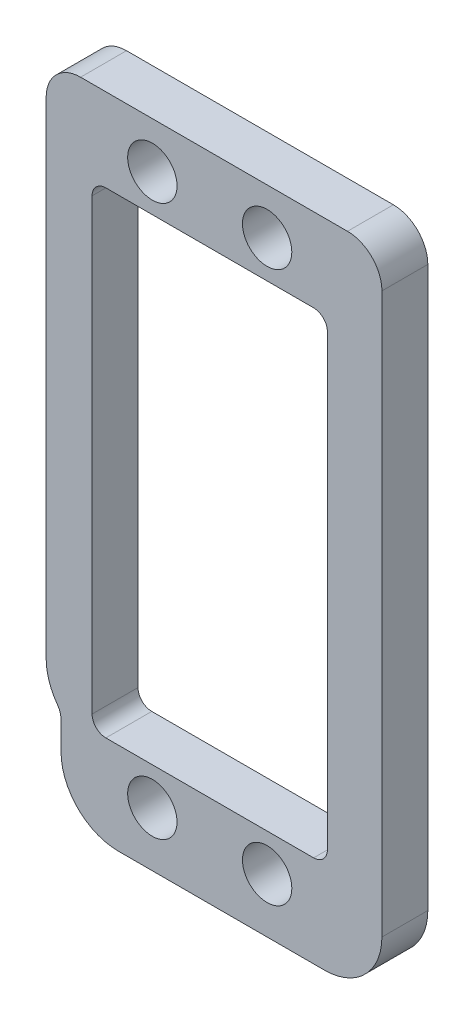
ISO-10303-21;
HEADER;
FILE_DESCRIPTION(('STEP AP214'),'2;1');
FILE_NAME('part.step','',(''),(''),'','','');
FILE_SCHEMA(('AUTOMOTIVE_DESIGN { 1 0 10303 214 1 1 1 1 }'));
ENDSEC;
DATA;
#1=APPLICATION_CONTEXT('core data for automotive mechanical design processes');
#2=APPLICATION_PROTOCOL_DEFINITION('international standard','automotive_design',2000,#1);
#3=PRODUCT_CONTEXT('',#1,'mechanical');
#4=PRODUCT('Part','Part','',(#3));
#5=PRODUCT_RELATED_PRODUCT_CATEGORY('part','',(#4));
#6=PRODUCT_DEFINITION_FORMATION('','',#4);
#7=PRODUCT_DEFINITION_CONTEXT('part definition',#1,'design');
#8=PRODUCT_DEFINITION('design','',#6,#7);
#9=PRODUCT_DEFINITION_SHAPE('','',#8);
#10=(LENGTH_UNIT() NAMED_UNIT(*) SI_UNIT(.MILLI.,.METRE.));
#11=(NAMED_UNIT(*) PLANE_ANGLE_UNIT() SI_UNIT($,.RADIAN.));
#12=(NAMED_UNIT(*) SI_UNIT($,.STERADIAN.) SOLID_ANGLE_UNIT());
#13=UNCERTAINTY_MEASURE_WITH_UNIT(LENGTH_MEASURE(1.E-05),#10,'distance_accuracy_value','');
#14=(GEOMETRIC_REPRESENTATION_CONTEXT(3) GLOBAL_UNCERTAINTY_ASSIGNED_CONTEXT((#13)) GLOBAL_UNIT_ASSIGNED_CONTEXT((#10,
#11,#12)) REPRESENTATION_CONTEXT('',''));
#15=CARTESIAN_POINT('',(0.,0.,0.));
#16=DIRECTION('',(0.,0.,1.));
#17=DIRECTION('',(1.,0.,0.));
#18=AXIS2_PLACEMENT_3D('',#15,#16,#17);
#19=CARTESIAN_POINT('',(100.,0.,4.));
#20=DIRECTION('',(-1.,0.,0.));
#21=DIRECTION('',(0.,-1.,0.));
#22=AXIS2_PLACEMENT_3D('',#19,#20,#21);
#23=PLANE('',#22);
#24=DIRECTION('',(0.,1.,0.));
#25=VECTOR('',#24,1.);
#26=CARTESIAN_POINT('',(100.,0.,4.));
#27=LINE('',#26,#25);
#28=CARTESIAN_POINT('',(100.,-65.75,4.));
#29=VERTEX_POINT('',#28);
#30=CARTESIAN_POINT('',(100.,-17.,4.));
#31=VERTEX_POINT('',#30);
#32=EDGE_CURVE('E237',#29,#31,#27,.T.);
#33=ORIENTED_EDGE('',*,*,#32,.F.);
#34=DIRECTION('',(0.,0.,-1.));
#35=VECTOR('',#34,1.);
#36=CARTESIAN_POINT('',(100.,-65.75,0.));
#37=LINE('',#36,#35);
#38=CARTESIAN_POINT('',(100.,-65.75,0.));
#39=VERTEX_POINT('',#38);
#40=EDGE_CURVE('E305',#29,#39,#37,.T.);
#41=ORIENTED_EDGE('',*,*,#40,.T.);
#42=DIRECTION('',(0.,1.,0.));
#43=VECTOR('',#42,1.);
#44=CARTESIAN_POINT('',(100.,0.,0.));
#45=LINE('',#44,#43);
#46=CARTESIAN_POINT('',(100.,-17.,0.));
#47=VERTEX_POINT('',#46);
#48=EDGE_CURVE('E234',#39,#47,#45,.T.);
#49=ORIENTED_EDGE('',*,*,#48,.T.);
#50=DIRECTION('',(0.,0.,1.));
#51=VECTOR('',#50,1.);
#52=CARTESIAN_POINT('',(100.,-17.,4.));
#53=LINE('',#52,#51);
#54=EDGE_CURVE('E292',#47,#31,#53,.T.);
#55=ORIENTED_EDGE('',*,*,#54,.T.);
#56=EDGE_LOOP('',(#33,#41,#49,#55));
#57=FACE_BOUND('',#56,.T.);
#58=ADVANCED_FACE('F47',(#57),#23,.F.);
#59=CARTESIAN_POINT('',(72.04422863406,0.,-6.));
#60=DIRECTION('',(1.,0.,0.));
#61=DIRECTION('',(0.,0.,-1.));
#62=AXIS2_PLACEMENT_3D('',#59,#60,#61);
#63=PLANE('',#62);
#64=DIRECTION('',(0.,1.,0.));
#65=VECTOR('',#64,1.);
#66=CARTESIAN_POINT('',(72.04422863406,0.,0.));
#67=LINE('',#66,#65);
#68=CARTESIAN_POINT('',(72.04422863406,-65.75,0.));
#69=VERTEX_POINT('',#68);
#70=CARTESIAN_POINT('',(72.04422863406,-63.3230164028552,0.));
#71=VERTEX_POINT('',#70);
#72=EDGE_CURVE('E295',#69,#71,#67,.T.);
#73=ORIENTED_EDGE('',*,*,#72,.F.);
#74=DIRECTION('',(0.,0.,-1.));
#75=VECTOR('',#74,1.);
#76=CARTESIAN_POINT('',(72.04422863406,-65.75,4.));
#77=LINE('',#76,#75);
#78=CARTESIAN_POINT('',(72.04422863406,-65.75,4.));
#79=VERTEX_POINT('',#78);
#80=EDGE_CURVE('E11',#69,#79,#77,.F.);
#81=ORIENTED_EDGE('',*,*,#80,.T.);
#82=DIRECTION('',(0.,1.,0.));
#83=VECTOR('',#82,1.);
#84=CARTESIAN_POINT('',(72.04422863406,0.,4.));
#85=LINE('',#84,#83);
#86=CARTESIAN_POINT('',(72.04422863406,-63.3230164028552,4.));
#87=VERTEX_POINT('',#86);
#88=EDGE_CURVE('E352',#79,#87,#85,.T.);
#89=ORIENTED_EDGE('',*,*,#88,.T.);
#90=DIRECTION('',(0.,0.,1.));
#91=VECTOR('',#90,1.);
#92=CARTESIAN_POINT('',(72.04422863406,-63.3230164028552,0.));
#93=LINE('',#92,#91);
#94=EDGE_CURVE('E297',#87,#71,#93,.F.);
#95=ORIENTED_EDGE('',*,*,#94,.T.);
#96=EDGE_LOOP('',(#73,#81,#89,#95));
#97=FACE_BOUND('',#96,.T.);
#98=ADVANCED_FACE('F351',(#97),#63,.F.);
#99=CARTESIAN_POINT('',(70.75,0.,0.));
#100=DIRECTION('',(1.,0.,0.));
#101=DIRECTION('',(0.,0.,-1.));
#102=AXIS2_PLACEMENT_3D('',#99,#100,#101);
#103=PLANE('',#102);
#104=DIRECTION('',(0.,1.,0.));
#105=VECTOR('',#104,1.);
#106=CARTESIAN_POINT('',(70.75,0.,0.));
#107=LINE('',#106,#105);
#108=CARTESIAN_POINT('',(70.75,-59.3647799345297,0.));
#109=VERTEX_POINT('',#108);
#110=CARTESIAN_POINT('',(70.75,-17.,0.));
#111=VERTEX_POINT('',#110);
#112=EDGE_CURVE('E331',#109,#111,#107,.T.);
#113=ORIENTED_EDGE('',*,*,#112,.F.);
#114=DIRECTION('',(0.,0.,-1.));
#115=VECTOR('',#114,1.);
#116=CARTESIAN_POINT('',(70.75,-59.3647799345297,0.));
#117=LINE('',#116,#115);
#118=CARTESIAN_POINT('',(70.75,-59.3647799345297,4.));
#119=VERTEX_POINT('',#118);
#120=EDGE_CURVE('E55',#109,#119,#117,.F.);
#121=ORIENTED_EDGE('',*,*,#120,.T.);
#122=DIRECTION('',(0.,1.,0.));
#123=VECTOR('',#122,1.);
#124=CARTESIAN_POINT('',(70.75,0.,4.));
#125=LINE('',#124,#123);
#126=CARTESIAN_POINT('',(70.75,-17.,4.));
#127=VERTEX_POINT('',#126);
#128=EDGE_CURVE('E330',#119,#127,#125,.T.);
#129=ORIENTED_EDGE('',*,*,#128,.T.);
#130=DIRECTION('',(0.,0.,-1.));
#131=VECTOR('',#130,1.);
#132=CARTESIAN_POINT('',(70.75,-17.,0.));
#133=LINE('',#132,#131);
#134=EDGE_CURVE('E275',#127,#111,#133,.T.);
#135=ORIENTED_EDGE('',*,*,#134,.T.);
#136=EDGE_LOOP('',(#113,#121,#129,#135));
#137=FACE_BOUND('',#136,.T.);
#138=ADVANCED_FACE('F329',(#137),#103,.F.);
#139=CARTESIAN_POINT('',(0.,0.,4.));
#140=DIRECTION('',(0.,0.,1.));
#141=DIRECTION('',(1.,0.,0.));
#142=AXIS2_PLACEMENT_3D('',#139,#140,#141);
#143=PLANE('',#142);
#144=DIRECTION('',(1.,0.,0.));
#145=VECTOR('',#144,1.);
#146=CARTESIAN_POINT('',(0.,-70.75,4.));
#147=LINE('',#146,#145);
#148=CARTESIAN_POINT('',(77.04422863406,-70.75,4.));
#149=VERTEX_POINT('',#148);
#150=CARTESIAN_POINT('',(95.,-70.75,4.));
#151=VERTEX_POINT('',#150);
#152=EDGE_CURVE('E355',#149,#151,#147,.T.);
#153=ORIENTED_EDGE('',*,*,#152,.T.);
#154=CARTESIAN_POINT('',(95.,-65.75,4.));
#155=DIRECTION('',(0.,0.,1.));
#156=DIRECTION('',(1.,0.,0.));
#157=AXIS2_PLACEMENT_3D('',#154,#155,#156);
#158=CIRCLE('',#157,5.);
#159=EDGE_CURVE('E322',#151,#29,#158,.T.);
#160=ORIENTED_EDGE('',*,*,#159,.T.);
#161=ORIENTED_EDGE('',*,*,#32,.T.);
#162=CARTESIAN_POINT('',(97.,-17.,4.));
#163=DIRECTION('',(0.,0.,1.));
#164=DIRECTION('',(1.,0.,0.));
#165=AXIS2_PLACEMENT_3D('',#162,#163,#164);
#166=CIRCLE('',#165,3.);
#167=CARTESIAN_POINT('',(97.,-14.,4.));
#168=VERTEX_POINT('',#167);
#169=EDGE_CURVE('E287',#31,#168,#166,.T.);
#170=ORIENTED_EDGE('',*,*,#169,.T.);
#171=DIRECTION('',(1.,0.,0.));
#172=VECTOR('',#171,1.);
#173=CARTESIAN_POINT('',(0.,-14.,4.));
#174=LINE('',#173,#172);
#175=CARTESIAN_POINT('',(73.7500000000001,-14.,4.));
#176=VERTEX_POINT('',#175);
#177=EDGE_CURVE('E354',#176,#168,#174,.T.);
#178=ORIENTED_EDGE('',*,*,#177,.F.);
#179=CARTESIAN_POINT('',(73.7500000000001,-17.,4.));
#180=DIRECTION('',(0.,0.,1.));
#181=DIRECTION('',(1.,0.,0.));
#182=AXIS2_PLACEMENT_3D('',#179,#180,#181);
#183=CIRCLE('',#182,3.);
#184=EDGE_CURVE('E289',#176,#127,#183,.T.);
#185=ORIENTED_EDGE('',*,*,#184,.T.);
#186=ORIENTED_EDGE('',*,*,#128,.F.);
#187=CARTESIAN_POINT('',(75.7500000000001,-59.3647799345297,4.));
#188=DIRECTION('',(0.,0.,1.));
#189=DIRECTION('',(1.,0.,0.));
#190=AXIS2_PLACEMENT_3D('',#187,#188,#189);
#191=CIRCLE('',#190,5.);
#192=CARTESIAN_POINT('',(71.7158422642239,-62.3186877467129,4.));
#193=VERTEX_POINT('',#192);
#194=EDGE_CURVE('E68',#119,#193,#191,.T.);
#195=ORIENTED_EDGE('',*,*,#194,.T.);
#196=CARTESIAN_POINT('',(70.34422863406,-63.3230164028552,4.));
#197=DIRECTION('',(0.,0.,1.));
#198=DIRECTION('',(1.,0.,0.));
#199=AXIS2_PLACEMENT_3D('',#196,#197,#198);
#200=CIRCLE('',#199,1.7);
#201=EDGE_CURVE('E300',#193,#87,#200,.F.);
#202=ORIENTED_EDGE('',*,*,#201,.T.);
#203=ORIENTED_EDGE('',*,*,#88,.F.);
#204=CARTESIAN_POINT('',(77.04422863406,-65.75,4.));
#205=DIRECTION('',(0.,0.,1.));
#206=DIRECTION('',(1.,0.,0.));
#207=AXIS2_PLACEMENT_3D('',#204,#205,#206);
#208=CIRCLE('',#207,5.);
#209=EDGE_CURVE('E319',#79,#149,#208,.T.);
#210=ORIENTED_EDGE('',*,*,#209,.T.);
#211=EDGE_LOOP('',(#153,#160,#161,#170,#178,#185,#186,#195,#202,#203,#210));
#212=FACE_BOUND('',#211,.T.);
#213=CARTESIAN_POINT('',(80.,-18.,4.));
#214=DIRECTION('',(0.,0.,1.));
#215=DIRECTION('',(1.,0.,0.));
#216=AXIS2_PLACEMENT_3D('',#213,#214,#215);
#217=CIRCLE('',#216,2.15);
#218=CARTESIAN_POINT('',(82.15,-18.,4.));
#219=VERTEX_POINT('',#218);
#220=EDGE_CURVE('E222',#219,#219,#217,.T.);
#221=ORIENTED_EDGE('',*,*,#220,.F.);
#222=EDGE_LOOP('',(#221));
#223=FACE_BOUND('',#222,.T.);
#224=CARTESIAN_POINT('',(90.,-66.,4.));
#225=DIRECTION('',(0.,0.,1.));
#226=DIRECTION('',(1.,0.,0.));
#227=AXIS2_PLACEMENT_3D('',#224,#225,#226);
#228=CIRCLE('',#227,2.15);
#229=CARTESIAN_POINT('',(92.15,-66.,4.));
#230=VERTEX_POINT('',#229);
#231=EDGE_CURVE('E210',#230,#230,#228,.T.);
#232=ORIENTED_EDGE('',*,*,#231,.F.);
#233=EDGE_LOOP('',(#232));
#234=FACE_BOUND('',#233,.T.);
#235=CARTESIAN_POINT('',(80.,-66.,4.));
#236=DIRECTION('',(0.,0.,1.));
#237=DIRECTION('',(1.,0.,0.));
#238=AXIS2_PLACEMENT_3D('',#235,#236,#237);
#239=CIRCLE('',#238,2.15);
#240=CARTESIAN_POINT('',(82.15,-66.,4.));
#241=VERTEX_POINT('',#240);
#242=EDGE_CURVE('E226',#241,#241,#239,.T.);
#243=ORIENTED_EDGE('',*,*,#242,.F.);
#244=EDGE_LOOP('',(#243));
#245=FACE_BOUND('',#244,.T.);
#246=CARTESIAN_POINT('',(90.,-18.,4.));
#247=DIRECTION('',(0.,0.,1.));
#248=DIRECTION('',(1.,0.,0.));
#249=AXIS2_PLACEMENT_3D('',#246,#247,#248);
#250=CIRCLE('',#249,2.15);
#251=CARTESIAN_POINT('',(92.15,-18.,4.));
#252=VERTEX_POINT('',#251);
#253=EDGE_CURVE('E219',#252,#252,#250,.T.);
#254=ORIENTED_EDGE('',*,*,#253,.F.);
#255=EDGE_LOOP('',(#254));
#256=FACE_BOUND('',#255,.T.);
#257=DIRECTION('',(1.,0.,0.));
#258=VECTOR('',#257,1.);
#259=CARTESIAN_POINT('',(74.7500000000001,-62.75,4.));
#260=LINE('',#259,#258);
#261=CARTESIAN_POINT('',(75.9500000000001,-62.75,4.));
#262=VERTEX_POINT('',#261);
#263=CARTESIAN_POINT('',(94.05,-62.75,4.));
#264=VERTEX_POINT('',#263);
#265=EDGE_CURVE('E365',#262,#264,#260,.T.);
#266=ORIENTED_EDGE('',*,*,#265,.F.);
#267=CARTESIAN_POINT('',(75.9500000000001,-61.55,4.));
#268=DIRECTION('',(0.,0.,1.));
#269=DIRECTION('',(1.,0.,0.));
#270=AXIS2_PLACEMENT_3D('',#267,#268,#269);
#271=CIRCLE('',#270,1.2);
#272=CARTESIAN_POINT('',(74.7500000000001,-61.55,4.));
#273=VERTEX_POINT('',#272);
#274=EDGE_CURVE('E205',#262,#273,#271,.F.);
#275=ORIENTED_EDGE('',*,*,#274,.T.);
#276=DIRECTION('',(0.,-1.,0.));
#277=VECTOR('',#276,1.);
#278=CARTESIAN_POINT('',(74.7500000000001,-21.25,4.));
#279=LINE('',#278,#277);
#280=CARTESIAN_POINT('',(74.7500000000001,-22.45,4.));
#281=VERTEX_POINT('',#280);
#282=EDGE_CURVE('E196',#281,#273,#279,.T.);
#283=ORIENTED_EDGE('',*,*,#282,.F.);
#284=CARTESIAN_POINT('',(75.9500000000001,-22.45,4.));
#285=DIRECTION('',(0.,0.,1.));
#286=DIRECTION('',(1.,0.,0.));
#287=AXIS2_PLACEMENT_3D('',#284,#285,#286);
#288=CIRCLE('',#287,1.2);
#289=CARTESIAN_POINT('',(75.9500000000001,-21.25,4.));
#290=VERTEX_POINT('',#289);
#291=EDGE_CURVE('E179',#281,#290,#288,.F.);
#292=ORIENTED_EDGE('',*,*,#291,.T.);
#293=DIRECTION('',(1.,0.,0.));
#294=VECTOR('',#293,1.);
#295=CARTESIAN_POINT('',(74.7500000000001,-21.25,4.));
#296=LINE('',#295,#294);
#297=CARTESIAN_POINT('',(94.05,-21.25,4.));
#298=VERTEX_POINT('',#297);
#299=EDGE_CURVE('E207',#290,#298,#296,.T.);
#300=ORIENTED_EDGE('',*,*,#299,.T.);
#301=CARTESIAN_POINT('',(94.05,-22.45,4.));
#302=DIRECTION('',(0.,0.,1.));
#303=DIRECTION('',(1.,0.,0.));
#304=AXIS2_PLACEMENT_3D('',#301,#302,#303);
#305=CIRCLE('',#304,1.2);
#306=CARTESIAN_POINT('',(95.25,-22.45,4.));
#307=VERTEX_POINT('',#306);
#308=EDGE_CURVE('E271',#298,#307,#305,.F.);
#309=ORIENTED_EDGE('',*,*,#308,.T.);
#310=DIRECTION('',(0.,-1.,0.));
#311=VECTOR('',#310,1.);
#312=CARTESIAN_POINT('',(95.25,-21.25,4.));
#313=LINE('',#312,#311);
#314=CARTESIAN_POINT('',(95.25,-61.55,4.));
#315=VERTEX_POINT('',#314);
#316=EDGE_CURVE('E212',#307,#315,#313,.T.);
#317=ORIENTED_EDGE('',*,*,#316,.T.);
#318=CARTESIAN_POINT('',(94.05,-61.55,4.));
#319=DIRECTION('',(0.,0.,1.));
#320=DIRECTION('',(1.,0.,0.));
#321=AXIS2_PLACEMENT_3D('',#318,#319,#320);
#322=CIRCLE('',#321,1.2);
#323=EDGE_CURVE('E264',#315,#264,#322,.F.);
#324=ORIENTED_EDGE('',*,*,#323,.T.);
#325=EDGE_LOOP('',(#266,#275,#283,#292,#300,#309,#317,#324));
#326=FACE_BOUND('',#325,.T.);
#327=ADVANCED_FACE('F204',(#212,#223,#234,#245,#256,#326),#143,.T.);
#328=CARTESIAN_POINT('',(0.,0.,0.));
#329=DIRECTION('',(0.,0.,1.));
#330=DIRECTION('',(1.,0.,0.));
#331=AXIS2_PLACEMENT_3D('',#328,#329,#330);
#332=PLANE('',#331);
#333=ORIENTED_EDGE('',*,*,#48,.F.);
#334=CARTESIAN_POINT('',(95.,-65.75,0.));
#335=DIRECTION('',(0.,0.,1.));
#336=DIRECTION('',(1.,0.,0.));
#337=AXIS2_PLACEMENT_3D('',#334,#335,#336);
#338=CIRCLE('',#337,5.);
#339=CARTESIAN_POINT('',(95.,-70.75,0.));
#340=VERTEX_POINT('',#339);
#341=EDGE_CURVE('E312',#39,#340,#338,.F.);
#342=ORIENTED_EDGE('',*,*,#341,.T.);
#343=DIRECTION('',(-1.,0.,0.));
#344=VECTOR('',#343,1.);
#345=CARTESIAN_POINT('',(0.,-70.75,0.));
#346=LINE('',#345,#344);
#347=CARTESIAN_POINT('',(77.04422863406,-70.75,0.));
#348=VERTEX_POINT('',#347);
#349=EDGE_CURVE('E359',#340,#348,#346,.T.);
#350=ORIENTED_EDGE('',*,*,#349,.T.);
#351=CARTESIAN_POINT('',(77.04422863406,-65.75,0.));
#352=DIRECTION('',(0.,0.,1.));
#353=DIRECTION('',(1.,0.,0.));
#354=AXIS2_PLACEMENT_3D('',#351,#352,#353);
#355=CIRCLE('',#354,5.);
#356=EDGE_CURVE('E308',#348,#69,#355,.F.);
#357=ORIENTED_EDGE('',*,*,#356,.T.);
#358=ORIENTED_EDGE('',*,*,#72,.T.);
#359=CARTESIAN_POINT('',(70.34422863406,-63.3230164028552,0.));
#360=DIRECTION('',(0.,0.,1.));
#361=DIRECTION('',(1.,0.,0.));
#362=AXIS2_PLACEMENT_3D('',#359,#360,#361);
#363=CIRCLE('',#362,1.7);
#364=CARTESIAN_POINT('',(71.7158422642239,-62.3186877467129,0.));
#365=VERTEX_POINT('',#364);
#366=EDGE_CURVE('E302',#71,#365,#363,.T.);
#367=ORIENTED_EDGE('',*,*,#366,.T.);
#368=CARTESIAN_POINT('',(75.7500000000001,-59.3647799345297,0.));
#369=DIRECTION('',(0.,0.,1.));
#370=DIRECTION('',(1.,0.,0.));
#371=AXIS2_PLACEMENT_3D('',#368,#369,#370);
#372=CIRCLE('',#371,5.);
#373=EDGE_CURVE('E310',#365,#109,#372,.F.);
#374=ORIENTED_EDGE('',*,*,#373,.T.);
#375=ORIENTED_EDGE('',*,*,#112,.T.);
#376=CARTESIAN_POINT('',(73.7500000000001,-17.,0.));
#377=DIRECTION('',(0.,0.,1.));
#378=DIRECTION('',(1.,0.,0.));
#379=AXIS2_PLACEMENT_3D('',#376,#377,#378);
#380=CIRCLE('',#379,3.);
#381=CARTESIAN_POINT('',(73.7500000000001,-14.,0.));
#382=VERTEX_POINT('',#381);
#383=EDGE_CURVE('E281',#111,#382,#380,.F.);
#384=ORIENTED_EDGE('',*,*,#383,.T.);
#385=DIRECTION('',(1.,0.,0.));
#386=VECTOR('',#385,1.);
#387=CARTESIAN_POINT('',(0.,-14.,0.));
#388=LINE('',#387,#386);
#389=CARTESIAN_POINT('',(97.,-14.,0.));
#390=VERTEX_POINT('',#389);
#391=EDGE_CURVE('E338',#382,#390,#388,.T.);
#392=ORIENTED_EDGE('',*,*,#391,.T.);
#393=CARTESIAN_POINT('',(97.,-17.,0.));
#394=DIRECTION('',(0.,0.,1.));
#395=DIRECTION('',(1.,0.,0.));
#396=AXIS2_PLACEMENT_3D('',#393,#394,#395);
#397=CIRCLE('',#396,3.);
#398=EDGE_CURVE('E278',#390,#47,#397,.F.);
#399=ORIENTED_EDGE('',*,*,#398,.T.);
#400=EDGE_LOOP('',(#333,#342,#350,#357,#358,#367,#374,#375,#384,#392,#399));
#401=FACE_BOUND('',#400,.T.);
#402=CARTESIAN_POINT('',(80.,-18.,0.));
#403=DIRECTION('',(0.,0.,1.));
#404=DIRECTION('',(1.,0.,0.));
#405=AXIS2_PLACEMENT_3D('',#402,#403,#404);
#406=CIRCLE('',#405,2.15);
#407=CARTESIAN_POINT('',(82.15,-18.,0.));
#408=VERTEX_POINT('',#407);
#409=EDGE_CURVE('E231',#408,#408,#406,.T.);
#410=ORIENTED_EDGE('',*,*,#409,.T.);
#411=EDGE_LOOP('',(#410));
#412=FACE_BOUND('',#411,.T.);
#413=CARTESIAN_POINT('',(90.,-66.,0.));
#414=DIRECTION('',(0.,0.,1.));
#415=DIRECTION('',(1.,0.,0.));
#416=AXIS2_PLACEMENT_3D('',#413,#414,#415);
#417=CIRCLE('',#416,2.15);
#418=CARTESIAN_POINT('',(92.15,-66.,0.));
#419=VERTEX_POINT('',#418);
#420=EDGE_CURVE('E206',#419,#419,#417,.T.);
#421=ORIENTED_EDGE('',*,*,#420,.T.);
#422=EDGE_LOOP('',(#421));
#423=FACE_BOUND('',#422,.T.);
#424=CARTESIAN_POINT('',(80.,-66.,0.));
#425=DIRECTION('',(0.,0.,1.));
#426=DIRECTION('',(1.,0.,0.));
#427=AXIS2_PLACEMENT_3D('',#424,#425,#426);
#428=CIRCLE('',#427,2.15);
#429=CARTESIAN_POINT('',(82.15,-66.,0.));
#430=VERTEX_POINT('',#429);
#431=EDGE_CURVE('E217',#430,#430,#428,.T.);
#432=ORIENTED_EDGE('',*,*,#431,.T.);
#433=EDGE_LOOP('',(#432));
#434=FACE_BOUND('',#433,.T.);
#435=CARTESIAN_POINT('',(90.,-18.,0.));
#436=DIRECTION('',(0.,0.,1.));
#437=DIRECTION('',(1.,0.,0.));
#438=AXIS2_PLACEMENT_3D('',#435,#436,#437);
#439=CIRCLE('',#438,2.15);
#440=CARTESIAN_POINT('',(92.15,-18.,0.));
#441=VERTEX_POINT('',#440);
#442=EDGE_CURVE('E223',#441,#441,#439,.T.);
#443=ORIENTED_EDGE('',*,*,#442,.T.);
#444=EDGE_LOOP('',(#443));
#445=FACE_BOUND('',#444,.T.);
#446=DIRECTION('',(1.,0.,0.));
#447=VECTOR('',#446,1.);
#448=CARTESIAN_POINT('',(0.,-21.25,0.));
#449=LINE('',#448,#447);
#450=CARTESIAN_POINT('',(75.9500000000001,-21.25,0.));
#451=VERTEX_POINT('',#450);
#452=CARTESIAN_POINT('',(94.05,-21.25,0.));
#453=VERTEX_POINT('',#452);
#454=EDGE_CURVE('E243',#451,#453,#449,.T.);
#455=ORIENTED_EDGE('',*,*,#454,.F.);
#456=CARTESIAN_POINT('',(75.9500000000001,-22.45,0.));
#457=DIRECTION('',(0.,0.,1.));
#458=DIRECTION('',(1.,0.,0.));
#459=AXIS2_PLACEMENT_3D('',#456,#457,#458);
#460=CIRCLE('',#459,1.2);
#461=CARTESIAN_POINT('',(74.7500000000001,-22.45,0.));
#462=VERTEX_POINT('',#461);
#463=EDGE_CURVE('E189',#451,#462,#460,.T.);
#464=ORIENTED_EDGE('',*,*,#463,.T.);
#465=DIRECTION('',(0.,-1.,0.));
#466=VECTOR('',#465,1.);
#467=CARTESIAN_POINT('',(74.7500000000001,0.,0.));
#468=LINE('',#467,#466);
#469=CARTESIAN_POINT('',(74.7500000000001,-61.55,0.));
#470=VERTEX_POINT('',#469);
#471=EDGE_CURVE('E199',#462,#470,#468,.T.);
#472=ORIENTED_EDGE('',*,*,#471,.T.);
#473=CARTESIAN_POINT('',(75.9500000000001,-61.55,0.));
#474=DIRECTION('',(0.,0.,1.));
#475=DIRECTION('',(1.,0.,0.));
#476=AXIS2_PLACEMENT_3D('',#473,#474,#475);
#477=CIRCLE('',#476,1.2);
#478=CARTESIAN_POINT('',(75.9500000000001,-62.75,0.));
#479=VERTEX_POINT('',#478);
#480=EDGE_CURVE('E269',#470,#479,#477,.T.);
#481=ORIENTED_EDGE('',*,*,#480,.T.);
#482=DIRECTION('',(1.,0.,0.));
#483=VECTOR('',#482,1.);
#484=CARTESIAN_POINT('',(0.,-62.75,0.));
#485=LINE('',#484,#483);
#486=CARTESIAN_POINT('',(94.05,-62.75,0.));
#487=VERTEX_POINT('',#486);
#488=EDGE_CURVE('E247',#479,#487,#485,.T.);
#489=ORIENTED_EDGE('',*,*,#488,.T.);
#490=CARTESIAN_POINT('',(94.05,-61.55,0.));
#491=DIRECTION('',(0.,0.,1.));
#492=DIRECTION('',(1.,0.,0.));
#493=AXIS2_PLACEMENT_3D('',#490,#491,#492);
#494=CIRCLE('',#493,1.2);
#495=CARTESIAN_POINT('',(95.25,-61.55,0.));
#496=VERTEX_POINT('',#495);
#497=EDGE_CURVE('E266',#487,#496,#494,.T.);
#498=ORIENTED_EDGE('',*,*,#497,.T.);
#499=DIRECTION('',(0.,-1.,0.));
#500=VECTOR('',#499,1.);
#501=CARTESIAN_POINT('',(95.25,0.,0.));
#502=LINE('',#501,#500);
#503=CARTESIAN_POINT('',(95.25,-22.45,0.));
#504=VERTEX_POINT('',#503);
#505=EDGE_CURVE('E239',#504,#496,#502,.T.);
#506=ORIENTED_EDGE('',*,*,#505,.F.);
#507=CARTESIAN_POINT('',(94.05,-22.45,0.));
#508=DIRECTION('',(0.,0.,1.));
#509=DIRECTION('',(1.,0.,0.));
#510=AXIS2_PLACEMENT_3D('',#507,#508,#509);
#511=CIRCLE('',#510,1.2);
#512=EDGE_CURVE('E273',#504,#453,#511,.T.);
#513=ORIENTED_EDGE('',*,*,#512,.T.);
#514=EDGE_LOOP('',(#455,#464,#472,#481,#489,#498,#506,#513));
#515=FACE_BOUND('',#514,.T.);
#516=ADVANCED_FACE('F348',(#401,#412,#423,#434,#445,#515),#332,.F.);
#517=CARTESIAN_POINT('',(80.,-18.,0.));
#518=DIRECTION('',(0.,0.,1.));
#519=DIRECTION('',(1.,0.,0.));
#520=AXIS2_PLACEMENT_3D('',#517,#518,#519);
#521=CYLINDRICAL_SURFACE('',#520,2.15);
#522=ORIENTED_EDGE('',*,*,#409,.F.);
#523=EDGE_LOOP('',(#522));
#524=FACE_BOUND('',#523,.T.);
#525=ORIENTED_EDGE('',*,*,#220,.T.);
#526=EDGE_LOOP('',(#525));
#527=FACE_BOUND('',#526,.T.);
#528=ADVANCED_FACE('F466',(#524,#527),#521,.F.);
#529=CARTESIAN_POINT('',(90.,-66.,0.));
#530=DIRECTION('',(0.,0.,1.));
#531=DIRECTION('',(1.,0.,0.));
#532=AXIS2_PLACEMENT_3D('',#529,#530,#531);
#533=CYLINDRICAL_SURFACE('',#532,2.15);
#534=ORIENTED_EDGE('',*,*,#420,.F.);
#535=EDGE_LOOP('',(#534));
#536=FACE_BOUND('',#535,.T.);
#537=ORIENTED_EDGE('',*,*,#231,.T.);
#538=EDGE_LOOP('',(#537));
#539=FACE_BOUND('',#538,.T.);
#540=ADVANCED_FACE('F470',(#536,#539),#533,.F.);
#541=CARTESIAN_POINT('',(80.,-66.,0.));
#542=DIRECTION('',(0.,0.,1.));
#543=DIRECTION('',(1.,0.,0.));
#544=AXIS2_PLACEMENT_3D('',#541,#542,#543);
#545=CYLINDRICAL_SURFACE('',#544,2.15);
#546=ORIENTED_EDGE('',*,*,#431,.F.);
#547=EDGE_LOOP('',(#546));
#548=FACE_BOUND('',#547,.T.);
#549=ORIENTED_EDGE('',*,*,#242,.T.);
#550=EDGE_LOOP('',(#549));
#551=FACE_BOUND('',#550,.T.);
#552=ADVANCED_FACE('F472',(#548,#551),#545,.F.);
#553=CARTESIAN_POINT('',(90.,-18.,0.));
#554=DIRECTION('',(0.,0.,1.));
#555=DIRECTION('',(1.,0.,0.));
#556=AXIS2_PLACEMENT_3D('',#553,#554,#555);
#557=CYLINDRICAL_SURFACE('',#556,2.15);
#558=ORIENTED_EDGE('',*,*,#442,.F.);
#559=EDGE_LOOP('',(#558));
#560=FACE_BOUND('',#559,.T.);
#561=ORIENTED_EDGE('',*,*,#253,.T.);
#562=EDGE_LOOP('',(#561));
#563=FACE_BOUND('',#562,.T.);
#564=ADVANCED_FACE('F475',(#560,#563),#557,.F.);
#565=CARTESIAN_POINT('',(74.7500000000001,-62.75,-6.));
#566=DIRECTION('',(0.,-1.,0.));
#567=DIRECTION('',(0.,0.,-1.));
#568=AXIS2_PLACEMENT_3D('',#565,#566,#567);
#569=PLANE('',#568);
#570=ORIENTED_EDGE('',*,*,#265,.T.);
#571=DIRECTION('',(0.,0.,1.));
#572=VECTOR('',#571,1.);
#573=CARTESIAN_POINT('',(94.05,-62.75,-6.));
#574=LINE('',#573,#572);
#575=EDGE_CURVE('E190',#264,#487,#574,.F.);
#576=ORIENTED_EDGE('',*,*,#575,.T.);
#577=ORIENTED_EDGE('',*,*,#488,.F.);
#578=DIRECTION('',(0.,0.,1.));
#579=VECTOR('',#578,1.);
#580=CARTESIAN_POINT('',(75.9500000000001,-62.75,4.));
#581=LINE('',#580,#579);
#582=EDGE_CURVE('E259',#479,#262,#581,.T.);
#583=ORIENTED_EDGE('',*,*,#582,.T.);
#584=EDGE_LOOP('',(#570,#576,#577,#583));
#585=FACE_BOUND('',#584,.T.);
#586=ADVANCED_FACE('F390',(#585),#569,.F.);
#587=CARTESIAN_POINT('',(74.7500000000001,-21.25,-6.));
#588=DIRECTION('',(-1.,0.,0.));
#589=DIRECTION('',(0.,0.,1.));
#590=AXIS2_PLACEMENT_3D('',#587,#588,#589);
#591=PLANE('',#590);
#592=ORIENTED_EDGE('',*,*,#471,.F.);
#593=DIRECTION('',(0.,0.,1.));
#594=VECTOR('',#593,1.);
#595=CARTESIAN_POINT('',(74.7500000000001,-22.45,-6.));
#596=LINE('',#595,#594);
#597=EDGE_CURVE('E183',#462,#281,#596,.T.);
#598=ORIENTED_EDGE('',*,*,#597,.T.);
#599=ORIENTED_EDGE('',*,*,#282,.T.);
#600=DIRECTION('',(0.,0.,1.));
#601=VECTOR('',#600,1.);
#602=CARTESIAN_POINT('',(74.7500000000001,-61.55,0.));
#603=LINE('',#602,#601);
#604=EDGE_CURVE('E201',#273,#470,#603,.F.);
#605=ORIENTED_EDGE('',*,*,#604,.T.);
#606=EDGE_LOOP('',(#592,#598,#599,#605));
#607=FACE_BOUND('',#606,.T.);
#608=ADVANCED_FACE('F195',(#607),#591,.F.);
#609=CARTESIAN_POINT('',(74.7500000000001,-21.25,-6.));
#610=DIRECTION('',(0.,-1.,0.));
#611=DIRECTION('',(0.,0.,-1.));
#612=AXIS2_PLACEMENT_3D('',#609,#610,#611);
#613=PLANE('',#612);
#614=ORIENTED_EDGE('',*,*,#299,.F.);
#615=DIRECTION('',(0.,0.,1.));
#616=VECTOR('',#615,1.);
#617=CARTESIAN_POINT('',(75.9500000000001,-21.25,-6.));
#618=LINE('',#617,#616);
#619=EDGE_CURVE('E184',#290,#451,#618,.F.);
#620=ORIENTED_EDGE('',*,*,#619,.T.);
#621=ORIENTED_EDGE('',*,*,#454,.T.);
#622=DIRECTION('',(0.,0.,1.));
#623=VECTOR('',#622,1.);
#624=CARTESIAN_POINT('',(94.05,-21.25,4.));
#625=LINE('',#624,#623);
#626=EDGE_CURVE('E200',#453,#298,#625,.T.);
#627=ORIENTED_EDGE('',*,*,#626,.T.);
#628=EDGE_LOOP('',(#614,#620,#621,#627));
#629=FACE_BOUND('',#628,.T.);
#630=ADVANCED_FACE('F382',(#629),#613,.T.);
#631=CARTESIAN_POINT('',(95.25,-21.25,-6.));
#632=DIRECTION('',(-1.,0.,0.));
#633=DIRECTION('',(0.,0.,1.));
#634=AXIS2_PLACEMENT_3D('',#631,#632,#633);
#635=PLANE('',#634);
#636=ORIENTED_EDGE('',*,*,#505,.T.);
#637=DIRECTION('',(0.,0.,1.));
#638=VECTOR('',#637,1.);
#639=CARTESIAN_POINT('',(95.25,-61.55,-6.));
#640=LINE('',#639,#638);
#641=EDGE_CURVE('E256',#496,#315,#640,.T.);
#642=ORIENTED_EDGE('',*,*,#641,.T.);
#643=ORIENTED_EDGE('',*,*,#316,.F.);
#644=DIRECTION('',(0.,0.,1.));
#645=VECTOR('',#644,1.);
#646=CARTESIAN_POINT('',(95.25,-22.45,0.));
#647=LINE('',#646,#645);
#648=EDGE_CURVE('E254',#307,#504,#647,.F.);
#649=ORIENTED_EDGE('',*,*,#648,.T.);
#650=EDGE_LOOP('',(#636,#642,#643,#649));
#651=FACE_BOUND('',#650,.T.);
#652=ADVANCED_FACE('F372',(#651),#635,.T.);
#653=CARTESIAN_POINT('',(75.9500000000001,-22.45,-6.));
#654=DIRECTION('',(0.,0.,1.));
#655=DIRECTION('',(1.,0.,0.));
#656=AXIS2_PLACEMENT_3D('',#653,#654,#655);
#657=CYLINDRICAL_SURFACE('',#656,1.2);
#658=ORIENTED_EDGE('',*,*,#463,.F.);
#659=ORIENTED_EDGE('',*,*,#619,.F.);
#660=ORIENTED_EDGE('',*,*,#291,.F.);
#661=ORIENTED_EDGE('',*,*,#597,.F.);
#662=EDGE_LOOP('',(#658,#659,#660,#661));
#663=FACE_BOUND('',#662,.T.);
#664=ADVANCED_FACE('F182',(#663),#657,.F.);
#665=CARTESIAN_POINT('',(94.05,-61.55,-6.));
#666=DIRECTION('',(0.,0.,1.));
#667=DIRECTION('',(1.,0.,0.));
#668=AXIS2_PLACEMENT_3D('',#665,#666,#667);
#669=CYLINDRICAL_SURFACE('',#668,1.2);
#670=ORIENTED_EDGE('',*,*,#497,.F.);
#671=ORIENTED_EDGE('',*,*,#575,.F.);
#672=ORIENTED_EDGE('',*,*,#323,.F.);
#673=ORIENTED_EDGE('',*,*,#641,.F.);
#674=EDGE_LOOP('',(#670,#671,#672,#673));
#675=FACE_BOUND('',#674,.T.);
#676=ADVANCED_FACE('F406',(#675),#669,.F.);
#677=CARTESIAN_POINT('',(75.9500000000001,-61.55,-6.));
#678=DIRECTION('',(0.,0.,-1.));
#679=DIRECTION('',(-1.,0.,0.));
#680=AXIS2_PLACEMENT_3D('',#677,#678,#679);
#681=CYLINDRICAL_SURFACE('',#680,1.2);
#682=ORIENTED_EDGE('',*,*,#480,.F.);
#683=ORIENTED_EDGE('',*,*,#604,.F.);
#684=ORIENTED_EDGE('',*,*,#274,.F.);
#685=ORIENTED_EDGE('',*,*,#582,.F.);
#686=EDGE_LOOP('',(#682,#683,#684,#685));
#687=FACE_BOUND('',#686,.T.);
#688=ADVANCED_FACE('F409',(#687),#681,.F.);
#689=CARTESIAN_POINT('',(94.05,-22.45,-6.));
#690=DIRECTION('',(0.,0.,-1.));
#691=DIRECTION('',(-1.,0.,0.));
#692=AXIS2_PLACEMENT_3D('',#689,#690,#691);
#693=CYLINDRICAL_SURFACE('',#692,1.2);
#694=ORIENTED_EDGE('',*,*,#512,.F.);
#695=ORIENTED_EDGE('',*,*,#648,.F.);
#696=ORIENTED_EDGE('',*,*,#308,.F.);
#697=ORIENTED_EDGE('',*,*,#626,.F.);
#698=EDGE_LOOP('',(#694,#695,#696,#697));
#699=FACE_BOUND('',#698,.T.);
#700=ADVANCED_FACE('F377',(#699),#693,.F.);
#701=CARTESIAN_POINT('',(0.,-14.,-6.));
#702=DIRECTION('',(0.,-1.,0.));
#703=DIRECTION('',(0.,0.,-1.));
#704=AXIS2_PLACEMENT_3D('',#701,#702,#703);
#705=PLANE('',#704);
#706=ORIENTED_EDGE('',*,*,#391,.F.);
#707=DIRECTION('',(0.,0.,-1.));
#708=VECTOR('',#707,1.);
#709=CARTESIAN_POINT('',(73.7500000000001,-14.,-6.));
#710=LINE('',#709,#708);
#711=EDGE_CURVE('E285',#382,#176,#710,.F.);
#712=ORIENTED_EDGE('',*,*,#711,.T.);
#713=ORIENTED_EDGE('',*,*,#177,.T.);
#714=DIRECTION('',(0.,0.,1.));
#715=VECTOR('',#714,1.);
#716=CARTESIAN_POINT('',(97.,-14.,-6.));
#717=LINE('',#716,#715);
#718=EDGE_CURVE('E283',#168,#390,#717,.F.);
#719=ORIENTED_EDGE('',*,*,#718,.T.);
#720=EDGE_LOOP('',(#706,#712,#713,#719));
#721=FACE_BOUND('',#720,.T.);
#722=ADVANCED_FACE('F416',(#721),#705,.F.);
#723=CARTESIAN_POINT('',(73.7500000000001,-17.,0.));
#724=DIRECTION('',(0.,0.,-1.));
#725=DIRECTION('',(-1.,0.,0.));
#726=AXIS2_PLACEMENT_3D('',#723,#724,#725);
#727=CYLINDRICAL_SURFACE('',#726,3.);
#728=ORIENTED_EDGE('',*,*,#184,.F.);
#729=ORIENTED_EDGE('',*,*,#711,.F.);
#730=ORIENTED_EDGE('',*,*,#383,.F.);
#731=ORIENTED_EDGE('',*,*,#134,.F.);
#732=EDGE_LOOP('',(#728,#729,#730,#731));
#733=FACE_BOUND('',#732,.T.);
#734=ADVANCED_FACE('F417',(#733),#727,.T.);
#735=CARTESIAN_POINT('',(97.,-17.,4.));
#736=DIRECTION('',(0.,0.,1.));
#737=DIRECTION('',(1.,0.,0.));
#738=AXIS2_PLACEMENT_3D('',#735,#736,#737);
#739=CYLINDRICAL_SURFACE('',#738,3.);
#740=ORIENTED_EDGE('',*,*,#398,.F.);
#741=ORIENTED_EDGE('',*,*,#718,.F.);
#742=ORIENTED_EDGE('',*,*,#169,.F.);
#743=ORIENTED_EDGE('',*,*,#54,.F.);
#744=EDGE_LOOP('',(#740,#741,#742,#743));
#745=FACE_BOUND('',#744,.T.);
#746=ADVANCED_FACE('F420',(#745),#739,.T.);
#747=CARTESIAN_POINT('',(70.34422863406,-63.3230164028552,-6.));
#748=DIRECTION('',(0.,0.,-1.));
#749=DIRECTION('',(-1.,0.,0.));
#750=AXIS2_PLACEMENT_3D('',#747,#748,#749);
#751=CYLINDRICAL_SURFACE('',#750,1.7);
#752=ORIENTED_EDGE('',*,*,#201,.F.);
#753=DIRECTION('',(0.,0.,-1.));
#754=VECTOR('',#753,1.);
#755=CARTESIAN_POINT('',(71.7158422642239,-62.3186877467129,-6.));
#756=LINE('',#755,#754);
#757=EDGE_CURVE('E324',#193,#365,#756,.T.);
#758=ORIENTED_EDGE('',*,*,#757,.T.);
#759=ORIENTED_EDGE('',*,*,#366,.F.);
#760=ORIENTED_EDGE('',*,*,#94,.F.);
#761=EDGE_LOOP('',(#752,#758,#759,#760));
#762=FACE_BOUND('',#761,.T.);
#763=ADVANCED_FACE('F344',(#762),#751,.F.);
#764=CARTESIAN_POINT('',(0.,-70.75,10.));
#765=DIRECTION('',(0.,-1.,0.));
#766=DIRECTION('',(0.,0.,-1.));
#767=AXIS2_PLACEMENT_3D('',#764,#765,#766);
#768=PLANE('',#767);
#769=ORIENTED_EDGE('',*,*,#349,.F.);
#770=DIRECTION('',(0.,0.,-1.));
#771=VECTOR('',#770,1.);
#772=CARTESIAN_POINT('',(95.,-70.75,4.));
#773=LINE('',#772,#771);
#774=EDGE_CURVE('E317',#340,#151,#773,.F.);
#775=ORIENTED_EDGE('',*,*,#774,.T.);
#776=ORIENTED_EDGE('',*,*,#152,.F.);
#777=DIRECTION('',(0.,0.,-1.));
#778=VECTOR('',#777,1.);
#779=CARTESIAN_POINT('',(77.04422863406,-70.75,0.));
#780=LINE('',#779,#778);
#781=EDGE_CURVE('E314',#149,#348,#780,.T.);
#782=ORIENTED_EDGE('',*,*,#781,.T.);
#783=EDGE_LOOP('',(#769,#775,#776,#782));
#784=FACE_BOUND('',#783,.T.);
#785=ADVANCED_FACE('F427',(#784),#768,.T.);
#786=CARTESIAN_POINT('',(95.,-65.75,4.));
#787=DIRECTION('',(0.,0.,1.));
#788=DIRECTION('',(1.,0.,0.));
#789=AXIS2_PLACEMENT_3D('',#786,#787,#788);
#790=CYLINDRICAL_SURFACE('',#789,5.);
#791=ORIENTED_EDGE('',*,*,#159,.F.);
#792=ORIENTED_EDGE('',*,*,#774,.F.);
#793=ORIENTED_EDGE('',*,*,#341,.F.);
#794=ORIENTED_EDGE('',*,*,#40,.F.);
#795=EDGE_LOOP('',(#791,#792,#793,#794));
#796=FACE_BOUND('',#795,.T.);
#797=ADVANCED_FACE('F428',(#796),#790,.T.);
#798=CARTESIAN_POINT('',(75.7500000000001,-59.3647799345297,-6.));
#799=DIRECTION('',(0.,0.,-1.));
#800=DIRECTION('',(-1.,0.,0.));
#801=AXIS2_PLACEMENT_3D('',#798,#799,#800);
#802=CYLINDRICAL_SURFACE('',#801,5.);
#803=ORIENTED_EDGE('',*,*,#194,.F.);
#804=ORIENTED_EDGE('',*,*,#120,.F.);
#805=ORIENTED_EDGE('',*,*,#373,.F.);
#806=ORIENTED_EDGE('',*,*,#757,.F.);
#807=EDGE_LOOP('',(#803,#804,#805,#806));
#808=FACE_BOUND('',#807,.T.);
#809=ADVANCED_FACE('F341',(#808),#802,.T.);
#810=CARTESIAN_POINT('',(77.04422863406,-65.75,10.));
#811=DIRECTION('',(0.,0.,1.));
#812=DIRECTION('',(1.,0.,0.));
#813=AXIS2_PLACEMENT_3D('',#810,#811,#812);
#814=CYLINDRICAL_SURFACE('',#813,5.);
#815=ORIENTED_EDGE('',*,*,#209,.F.);
#816=ORIENTED_EDGE('',*,*,#80,.F.);
#817=ORIENTED_EDGE('',*,*,#356,.F.);
#818=ORIENTED_EDGE('',*,*,#781,.F.);
#819=EDGE_LOOP('',(#815,#816,#817,#818));
#820=FACE_BOUND('',#819,.T.);
#821=ADVANCED_FACE('F49',(#820),#814,.T.);
#822=CLOSED_SHELL('',(#58,#98,#138,#327,#516,#528,#540,#552,#564,#586,#608,#630,#652,#664,#676,
#688,#700,#722,#734,#746,#763,#785,#797,#809,#821));
#823=MANIFOLD_SOLID_BREP('B2',#822);
#824=ADVANCED_BREP_SHAPE_REPRESENTATION('',(#18,#823),#14);
#825=SHAPE_DEFINITION_REPRESENTATION(#9,#824);
ENDSEC;
END-ISO-10303-21;
